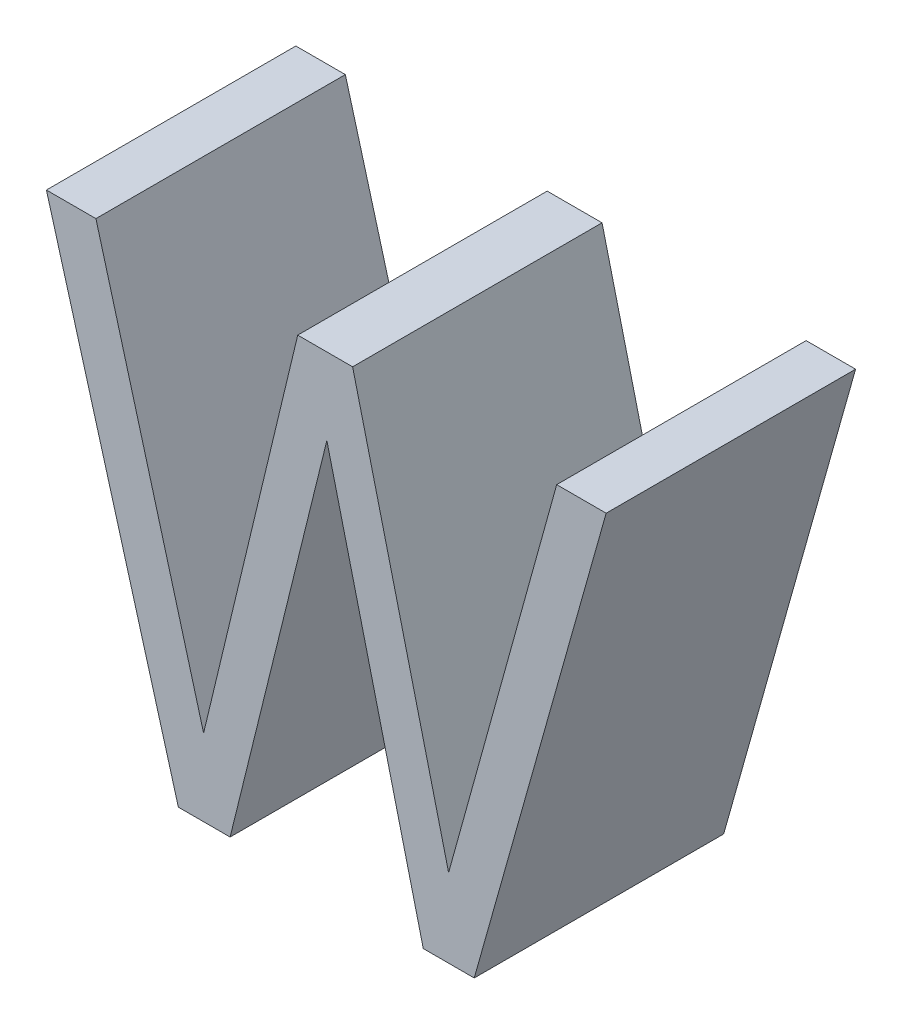
ISO-10303-21;
HEADER;
FILE_DESCRIPTION(('STEP AP214'),'2;1');
FILE_NAME('part.step','',(''),(''),'','','');
FILE_SCHEMA(('AUTOMOTIVE_DESIGN { 1 0 10303 214 1 1 1 1 }'));
ENDSEC;
DATA;
#1=APPLICATION_CONTEXT('core data for automotive mechanical design processes');
#2=APPLICATION_PROTOCOL_DEFINITION('international standard','automotive_design',2000,#1);
#3=PRODUCT_CONTEXT('',#1,'mechanical');
#4=PRODUCT('Part','Part','',(#3));
#5=PRODUCT_RELATED_PRODUCT_CATEGORY('part','',(#4));
#6=PRODUCT_DEFINITION_FORMATION('','',#4);
#7=PRODUCT_DEFINITION_CONTEXT('part definition',#1,'design');
#8=PRODUCT_DEFINITION('design','',#6,#7);
#9=PRODUCT_DEFINITION_SHAPE('','',#8);
#10=(LENGTH_UNIT() NAMED_UNIT(*) SI_UNIT(.MILLI.,.METRE.));
#11=(NAMED_UNIT(*) PLANE_ANGLE_UNIT() SI_UNIT($,.RADIAN.));
#12=(NAMED_UNIT(*) SI_UNIT($,.STERADIAN.) SOLID_ANGLE_UNIT());
#13=UNCERTAINTY_MEASURE_WITH_UNIT(LENGTH_MEASURE(1.E-05),#10,'distance_accuracy_value','');
#14=(GEOMETRIC_REPRESENTATION_CONTEXT(3) GLOBAL_UNCERTAINTY_ASSIGNED_CONTEXT((#13)) GLOBAL_UNIT_ASSIGNED_CONTEXT((#10,
#11,#12)) REPRESENTATION_CONTEXT('',''));
#15=CARTESIAN_POINT('',(0.,0.,0.));
#16=DIRECTION('',(0.,0.,1.));
#17=DIRECTION('',(1.,0.,0.));
#18=AXIS2_PLACEMENT_3D('',#15,#16,#17);
#19=CARTESIAN_POINT('',(-1.835082792432,-5.151383173215,-5.5));
#20=DIRECTION('',(0.,0.,1.));
#21=DIRECTION('',(0.,-1.,0.));
#22=AXIS2_PLACEMENT_3D('',#19,#20,#21);
#23=PLANE('',#22);
#24=DIRECTION('',(0.271054674454794,0.962563952917522,0.));
#25=VECTOR('',#24,1.);
#26=CARTESIAN_POINT('',(-1.24119866919,-6.13847583919,-5.5));
#27=LINE('',#26,#25);
#28=CARTESIAN_POINT('',(-1.24119866919,-6.13847583919,-5.5));
#29=VERTEX_POINT('',#28);
#30=CARTESIAN_POINT('',(-0.71229446919,-4.260241794746,-5.5));
#31=VERTEX_POINT('',#30);
#32=EDGE_CURVE('E182',#29,#31,#27,.T.);
#33=ORIENTED_EDGE('',*,*,#32,.T.);
#34=DIRECTION('',(-1.,0.,0.));
#35=VECTOR('',#34,1.);
#36=CARTESIAN_POINT('',(-0.71229446919,-4.260241794746,-5.5));
#37=LINE('',#36,#35);
#38=CARTESIAN_POINT('',(-0.910606380301,-4.260241794746,-5.5));
#39=VERTEX_POINT('',#38);
#40=EDGE_CURVE('E260',#31,#39,#37,.T.);
#41=ORIENTED_EDGE('',*,*,#40,.T.);
#42=DIRECTION('',(-0.267047823164026,-0.963683277920373,0.));
#43=VECTOR('',#42,1.);
#44=CARTESIAN_POINT('',(-0.910606380301,-4.260241794746,-5.5));
#45=LINE('',#44,#43);
#46=CARTESIAN_POINT('',(-1.343936024746,-5.823978683634,-5.5));
#47=VERTEX_POINT('',#46);
#48=EDGE_CURVE('E215',#39,#47,#45,.T.);
#49=ORIENTED_EDGE('',*,*,#48,.T.);
#50=DIRECTION('',(-0.238953078095094,0.971031115087915,0.));
#51=VECTOR('',#50,1.);
#52=CARTESIAN_POINT('',(-1.343936024746,-5.823978683634,-5.5));
#53=LINE('',#52,#51);
#54=CARTESIAN_POINT('',(-1.728743202523,-4.260241794746,-5.5));
#55=VERTEX_POINT('',#54);
#56=EDGE_CURVE('E194',#47,#55,#53,.T.);
#57=ORIENTED_EDGE('',*,*,#56,.T.);
#58=DIRECTION('',(-1.,0.,0.));
#59=VECTOR('',#58,1.);
#60=CARTESIAN_POINT('',(-1.728743202523,-4.260241794746,-5.5));
#61=LINE('',#60,#59);
#62=CARTESIAN_POINT('',(-1.948789046968,-4.260241794746,-5.5));
#63=VERTEX_POINT('',#62);
#64=EDGE_CURVE('E150',#55,#63,#61,.T.);
#65=ORIENTED_EDGE('',*,*,#64,.T.);
#66=DIRECTION('',(-0.233642560836271,-0.972322556441981,0.));
#67=VECTOR('',#66,1.);
#68=CARTESIAN_POINT('',(-1.948789046968,-4.260241794746,-5.5));
#69=LINE('',#68,#67);
#70=CARTESIAN_POINT('',(-2.326182246968,-5.830794350301,-5.5));
#71=VERTEX_POINT('',#70);
#72=EDGE_CURVE('E146',#63,#71,#69,.T.);
#73=ORIENTED_EDGE('',*,*,#72,.T.);
#74=DIRECTION('',(-0.265058017413111,0.964232465438201,0.));
#75=VECTOR('',#74,1.);
#76=CARTESIAN_POINT('',(-2.326182246968,-5.830794350301,-5.5));
#77=LINE('',#76,#75);
#78=CARTESIAN_POINT('',(-2.757911691412,-4.260241794746,-5.5));
#79=VERTEX_POINT('',#78);
#80=EDGE_CURVE('E132',#71,#79,#77,.T.);
#81=ORIENTED_EDGE('',*,*,#80,.T.);
#82=DIRECTION('',(-1.,0.,0.));
#83=VECTOR('',#82,1.);
#84=CARTESIAN_POINT('',(-2.757911691412,-4.260241794746,-5.5));
#85=LINE('',#84,#83);
#86=CARTESIAN_POINT('',(-2.95635906919,-4.260241794746,-5.5));
#87=VERTEX_POINT('',#86);
#88=EDGE_CURVE('E195',#79,#87,#85,.T.);
#89=ORIENTED_EDGE('',*,*,#88,.T.);
#90=DIRECTION('',(0.271118996413233,-0.962545837757289,0.));
#91=VECTOR('',#90,1.);
#92=CARTESIAN_POINT('',(-2.95635906919,-4.260241794746,-5.5));
#93=LINE('',#92,#91);
#94=CARTESIAN_POINT('',(-2.427319402523,-6.13847583919,-5.5));
#95=VERTEX_POINT('',#94);
#96=EDGE_CURVE('E220',#87,#95,#93,.T.);
#97=ORIENTED_EDGE('',*,*,#96,.T.);
#98=DIRECTION('',(1.,0.,0.));
#99=VECTOR('',#98,1.);
#100=CARTESIAN_POINT('',(-2.427319402523,-6.13847583919,-5.5));
#101=LINE('',#100,#99);
#102=CARTESIAN_POINT('',(-2.219869135857,-6.13847583919,-5.5));
#103=VERTEX_POINT('',#102);
#104=EDGE_CURVE('E169',#95,#103,#101,.T.);
#105=ORIENTED_EDGE('',*,*,#104,.T.);
#106=DIRECTION('',(0.239734119890295,0.970838581722227,0.));
#107=VECTOR('',#106,1.);
#108=CARTESIAN_POINT('',(-2.219869135857,-6.13847583919,-5.5));
#109=LINE('',#108,#107);
#110=CARTESIAN_POINT('',(-1.832011135857,-4.567787816968,-5.5));
#111=VERTEX_POINT('',#110);
#112=EDGE_CURVE('E175',#103,#111,#109,.T.);
#113=ORIENTED_EDGE('',*,*,#112,.T.);
#114=DIRECTION('',(0.238966075466545,-0.971027916579188,0.));
#115=VECTOR('',#114,1.);
#116=CARTESIAN_POINT('',(-1.832011135857,-4.567787816968,-5.5));
#117=LINE('',#116,#115);
#118=CARTESIAN_POINT('',(-1.445471113635,-6.13847583919,-5.5));
#119=VERTEX_POINT('',#118);
#120=EDGE_CURVE('E233',#111,#119,#117,.T.);
#121=ORIENTED_EDGE('',*,*,#120,.T.);
#122=DIRECTION('',(1.,0.,0.));
#123=VECTOR('',#122,1.);
#124=CARTESIAN_POINT('',(-1.445471113635,-6.13847583919,-5.5));
#125=LINE('',#124,#123);
#126=EDGE_CURVE('E11',#119,#29,#125,.T.);
#127=ORIENTED_EDGE('',*,*,#126,.T.);
#128=EDGE_LOOP('',(#33,#41,#49,#57,#65,#73,#81,#89,#97,#105,#113,#121,#127));
#129=FACE_BOUND('',#128,.T.);
#130=ADVANCED_FACE('F16',(#129),#23,.T.);
#131=CARTESIAN_POINT('',(-1.835082792432,-5.151383173215,-6.5));
#132=DIRECTION('',(0.,0.,1.));
#133=DIRECTION('',(0.,-1.,0.));
#134=AXIS2_PLACEMENT_3D('',#131,#132,#133);
#135=PLANE('',#134);
#136=DIRECTION('',(0.271054674454794,0.962563952917522,0.));
#137=VECTOR('',#136,1.);
#138=CARTESIAN_POINT('',(-1.24119866919,-6.13847583919,-6.5));
#139=LINE('',#138,#137);
#140=CARTESIAN_POINT('',(-1.24119866919,-6.13847583919,-6.5));
#141=VERTEX_POINT('',#140);
#142=CARTESIAN_POINT('',(-0.71229446919,-4.260241794746,-6.5));
#143=VERTEX_POINT('',#142);
#144=EDGE_CURVE('E205',#141,#143,#139,.T.);
#145=ORIENTED_EDGE('',*,*,#144,.F.);
#146=DIRECTION('',(1.,0.,0.));
#147=VECTOR('',#146,1.);
#148=CARTESIAN_POINT('',(-1.445471113635,-6.13847583919,-6.5));
#149=LINE('',#148,#147);
#150=CARTESIAN_POINT('',(-1.445471113635,-6.13847583919,-6.5));
#151=VERTEX_POINT('',#150);
#152=EDGE_CURVE('E27',#151,#141,#149,.T.);
#153=ORIENTED_EDGE('',*,*,#152,.F.);
#154=DIRECTION('',(0.238966075466545,-0.971027916579188,0.));
#155=VECTOR('',#154,1.);
#156=CARTESIAN_POINT('',(-1.832011135857,-4.567787816968,-6.5));
#157=LINE('',#156,#155);
#158=CARTESIAN_POINT('',(-1.832011135857,-4.567787816968,-6.5));
#159=VERTEX_POINT('',#158);
#160=EDGE_CURVE('E231',#159,#151,#157,.T.);
#161=ORIENTED_EDGE('',*,*,#160,.F.);
#162=DIRECTION('',(0.239734119890295,0.970838581722227,0.));
#163=VECTOR('',#162,1.);
#164=CARTESIAN_POINT('',(-2.219869135857,-6.13847583919,-6.5));
#165=LINE('',#164,#163);
#166=CARTESIAN_POINT('',(-2.219869135857,-6.13847583919,-6.5));
#167=VERTEX_POINT('',#166);
#168=EDGE_CURVE('E176',#167,#159,#165,.T.);
#169=ORIENTED_EDGE('',*,*,#168,.F.);
#170=DIRECTION('',(1.,0.,0.));
#171=VECTOR('',#170,1.);
#172=CARTESIAN_POINT('',(-2.427319402523,-6.13847583919,-6.5));
#173=LINE('',#172,#171);
#174=CARTESIAN_POINT('',(-2.427319402523,-6.13847583919,-6.5));
#175=VERTEX_POINT('',#174);
#176=EDGE_CURVE('E170',#175,#167,#173,.T.);
#177=ORIENTED_EDGE('',*,*,#176,.F.);
#178=DIRECTION('',(0.271118996413233,-0.962545837757289,0.));
#179=VECTOR('',#178,1.);
#180=CARTESIAN_POINT('',(-2.95635906919,-4.260241794746,-6.5));
#181=LINE('',#180,#179);
#182=CARTESIAN_POINT('',(-2.95635906919,-4.260241794746,-6.5));
#183=VERTEX_POINT('',#182);
#184=EDGE_CURVE('E198',#183,#175,#181,.T.);
#185=ORIENTED_EDGE('',*,*,#184,.F.);
#186=DIRECTION('',(-1.,0.,0.));
#187=VECTOR('',#186,1.);
#188=CARTESIAN_POINT('',(-2.757911691412,-4.260241794746,-6.5));
#189=LINE('',#188,#187);
#190=CARTESIAN_POINT('',(-2.757911691412,-4.260241794746,-6.5));
#191=VERTEX_POINT('',#190);
#192=EDGE_CURVE('E20',#191,#183,#189,.T.);
#193=ORIENTED_EDGE('',*,*,#192,.F.);
#194=DIRECTION('',(-0.265058017413111,0.964232465438201,0.));
#195=VECTOR('',#194,1.);
#196=CARTESIAN_POINT('',(-2.326182246968,-5.830794350301,-6.5));
#197=LINE('',#196,#195);
#198=CARTESIAN_POINT('',(-2.326182246968,-5.830794350301,-6.5));
#199=VERTEX_POINT('',#198);
#200=EDGE_CURVE('E155',#199,#191,#197,.T.);
#201=ORIENTED_EDGE('',*,*,#200,.F.);
#202=DIRECTION('',(-0.233642560836271,-0.972322556441981,0.));
#203=VECTOR('',#202,1.);
#204=CARTESIAN_POINT('',(-1.948789046968,-4.260241794746,-6.5));
#205=LINE('',#204,#203);
#206=CARTESIAN_POINT('',(-1.948789046968,-4.260241794746,-6.5));
#207=VERTEX_POINT('',#206);
#208=EDGE_CURVE('E158',#207,#199,#205,.T.);
#209=ORIENTED_EDGE('',*,*,#208,.F.);
#210=DIRECTION('',(-1.,0.,0.));
#211=VECTOR('',#210,1.);
#212=CARTESIAN_POINT('',(-1.728743202523,-4.260241794746,-6.5));
#213=LINE('',#212,#211);
#214=CARTESIAN_POINT('',(-1.728743202523,-4.260241794746,-6.5));
#215=VERTEX_POINT('',#214);
#216=EDGE_CURVE('E189',#215,#207,#213,.T.);
#217=ORIENTED_EDGE('',*,*,#216,.F.);
#218=DIRECTION('',(-0.238953078095094,0.971031115087915,0.));
#219=VECTOR('',#218,1.);
#220=CARTESIAN_POINT('',(-1.343936024746,-5.823978683634,-6.5));
#221=LINE('',#220,#219);
#222=CARTESIAN_POINT('',(-1.343936024746,-5.823978683634,-6.5));
#223=VERTEX_POINT('',#222);
#224=EDGE_CURVE('E210',#223,#215,#221,.T.);
#225=ORIENTED_EDGE('',*,*,#224,.F.);
#226=DIRECTION('',(-0.267047823164026,-0.963683277920373,0.));
#227=VECTOR('',#226,1.);
#228=CARTESIAN_POINT('',(-0.910606380301,-4.260241794746,-6.5));
#229=LINE('',#228,#227);
#230=CARTESIAN_POINT('',(-0.910606380301,-4.260241794746,-6.5));
#231=VERTEX_POINT('',#230);
#232=EDGE_CURVE('E256',#231,#223,#229,.T.);
#233=ORIENTED_EDGE('',*,*,#232,.F.);
#234=DIRECTION('',(-1.,0.,0.));
#235=VECTOR('',#234,1.);
#236=CARTESIAN_POINT('',(-0.71229446919,-4.260241794746,-6.5));
#237=LINE('',#236,#235);
#238=EDGE_CURVE('E185',#143,#231,#237,.T.);
#239=ORIENTED_EDGE('',*,*,#238,.F.);
#240=EDGE_LOOP('',(#145,#153,#161,#169,#177,#185,#193,#201,#209,#217,#225,#233,#239));
#241=FACE_BOUND('',#240,.T.);
#242=ADVANCED_FACE('F289',(#241),#135,.F.);
#243=CARTESIAN_POINT('',(-1.3433348914125,-6.13847583919,-5.49));
#244=DIRECTION('',(0.,1.,0.));
#245=DIRECTION('',(-1.,0.,0.));
#246=AXIS2_PLACEMENT_3D('',#243,#244,#245);
#247=PLANE('',#246);
#248=DIRECTION('',(0.,0.,1.));
#249=VECTOR('',#248,1.);
#250=CARTESIAN_POINT('',(-1.445471113635,-6.13847583919,-6.5));
#251=LINE('',#250,#249);
#252=EDGE_CURVE('E236',#151,#119,#251,.T.);
#253=ORIENTED_EDGE('',*,*,#252,.F.);
#254=ORIENTED_EDGE('',*,*,#152,.T.);
#255=DIRECTION('',(0.,0.,1.));
#256=VECTOR('',#255,1.);
#257=CARTESIAN_POINT('',(-1.24119866919,-6.13847583919,-6.5));
#258=LINE('',#257,#256);
#259=EDGE_CURVE('E246',#141,#29,#258,.T.);
#260=ORIENTED_EDGE('',*,*,#259,.T.);
#261=ORIENTED_EDGE('',*,*,#126,.F.);
#262=EDGE_LOOP('',(#253,#254,#260,#261));
#263=FACE_BOUND('',#262,.T.);
#264=ADVANCED_FACE('F312',(#263),#247,.F.);
#265=CARTESIAN_POINT('',(-1.638741124746,-5.353131828079,-5.49));
#266=DIRECTION('',(0.971027916579188,0.238966075466545,0.));
#267=DIRECTION('',(0.,0.,-1.));
#268=AXIS2_PLACEMENT_3D('',#265,#266,#267);
#269=PLANE('',#268);
#270=DIRECTION('',(0.,0.,1.));
#271=VECTOR('',#270,1.);
#272=CARTESIAN_POINT('',(-1.832011135857,-4.567787816968,-6.5));
#273=LINE('',#272,#271);
#274=EDGE_CURVE('E171',#159,#111,#273,.T.);
#275=ORIENTED_EDGE('',*,*,#274,.F.);
#276=ORIENTED_EDGE('',*,*,#160,.T.);
#277=ORIENTED_EDGE('',*,*,#252,.T.);
#278=ORIENTED_EDGE('',*,*,#120,.F.);
#279=EDGE_LOOP('',(#275,#276,#277,#278));
#280=FACE_BOUND('',#279,.T.);
#281=ADVANCED_FACE('F311',(#280),#269,.F.);
#282=CARTESIAN_POINT('',(-2.025940135857,-5.353131828079,-5.49));
#283=DIRECTION('',(-0.970838581722227,0.239734119890295,0.));
#284=DIRECTION('',(0.,0.,1.));
#285=AXIS2_PLACEMENT_3D('',#282,#283,#284);
#286=PLANE('',#285);
#287=DIRECTION('',(0.,0.,1.));
#288=VECTOR('',#287,1.);
#289=CARTESIAN_POINT('',(-2.219869135857,-6.13847583919,-6.5));
#290=LINE('',#289,#288);
#291=EDGE_CURVE('E166',#167,#103,#290,.T.);
#292=ORIENTED_EDGE('',*,*,#291,.F.);
#293=ORIENTED_EDGE('',*,*,#168,.T.);
#294=ORIENTED_EDGE('',*,*,#274,.T.);
#295=ORIENTED_EDGE('',*,*,#112,.F.);
#296=EDGE_LOOP('',(#292,#293,#294,#295));
#297=FACE_BOUND('',#296,.T.);
#298=ADVANCED_FACE('F309',(#297),#286,.F.);
#299=CARTESIAN_POINT('',(-2.32359426919,-6.13847583919,-5.49));
#300=DIRECTION('',(0.,1.,0.));
#301=DIRECTION('',(-1.,0.,0.));
#302=AXIS2_PLACEMENT_3D('',#299,#300,#301);
#303=PLANE('',#302);
#304=DIRECTION('',(0.,0.,1.));
#305=VECTOR('',#304,1.);
#306=CARTESIAN_POINT('',(-2.427319402523,-6.13847583919,-6.5));
#307=LINE('',#306,#305);
#308=EDGE_CURVE('E216',#175,#95,#307,.T.);
#309=ORIENTED_EDGE('',*,*,#308,.F.);
#310=ORIENTED_EDGE('',*,*,#176,.T.);
#311=ORIENTED_EDGE('',*,*,#291,.T.);
#312=ORIENTED_EDGE('',*,*,#104,.F.);
#313=EDGE_LOOP('',(#309,#310,#311,#312));
#314=FACE_BOUND('',#313,.T.);
#315=ADVANCED_FACE('F305',(#314),#303,.F.);
#316=CARTESIAN_POINT('',(-2.6918392358565,-5.199358816968,-5.49));
#317=DIRECTION('',(0.962545837757289,0.271118996413233,0.));
#318=DIRECTION('',(0.,0.,-1.));
#319=AXIS2_PLACEMENT_3D('',#316,#317,#318);
#320=PLANE('',#319);
#321=DIRECTION('',(0.,0.,1.));
#322=VECTOR('',#321,1.);
#323=CARTESIAN_POINT('',(-2.95635906919,-4.260241794746,-6.5));
#324=LINE('',#323,#322);
#325=EDGE_CURVE('E199',#183,#87,#324,.T.);
#326=ORIENTED_EDGE('',*,*,#325,.F.);
#327=ORIENTED_EDGE('',*,*,#184,.T.);
#328=ORIENTED_EDGE('',*,*,#308,.T.);
#329=ORIENTED_EDGE('',*,*,#96,.F.);
#330=EDGE_LOOP('',(#326,#327,#328,#329));
#331=FACE_BOUND('',#330,.T.);
#332=ADVANCED_FACE('F299',(#331),#320,.F.);
#333=CARTESIAN_POINT('',(-2.857135380301,-4.260241794746,-5.49));
#334=DIRECTION('',(0.,-1.,0.));
#335=DIRECTION('',(0.,0.,1.));
#336=AXIS2_PLACEMENT_3D('',#333,#334,#335);
#337=PLANE('',#336);
#338=DIRECTION('',(0.,0.,1.));
#339=VECTOR('',#338,1.);
#340=CARTESIAN_POINT('',(-2.757911691412,-4.260241794746,-6.5));
#341=LINE('',#340,#339);
#342=EDGE_CURVE('E140',#191,#79,#341,.T.);
#343=ORIENTED_EDGE('',*,*,#342,.F.);
#344=ORIENTED_EDGE('',*,*,#192,.T.);
#345=ORIENTED_EDGE('',*,*,#325,.T.);
#346=ORIENTED_EDGE('',*,*,#88,.F.);
#347=EDGE_LOOP('',(#343,#344,#345,#346));
#348=FACE_BOUND('',#347,.T.);
#349=ADVANCED_FACE('F294',(#348),#337,.F.);
#350=CARTESIAN_POINT('',(-2.54204696919,-5.0455180725235,-5.49));
#351=DIRECTION('',(-0.964232465438201,-0.265058017413111,0.));
#352=DIRECTION('',(0.,0.,1.));
#353=AXIS2_PLACEMENT_3D('',#350,#351,#352);
#354=PLANE('',#353);
#355=DIRECTION('',(0.,0.,1.));
#356=VECTOR('',#355,1.);
#357=CARTESIAN_POINT('',(-2.326182246968,-5.830794350301,-6.5));
#358=LINE('',#357,#356);
#359=EDGE_CURVE('E137',#199,#71,#358,.T.);
#360=ORIENTED_EDGE('',*,*,#359,.F.);
#361=ORIENTED_EDGE('',*,*,#200,.T.);
#362=ORIENTED_EDGE('',*,*,#342,.T.);
#363=ORIENTED_EDGE('',*,*,#80,.F.);
#364=EDGE_LOOP('',(#360,#361,#362,#363));
#365=FACE_BOUND('',#364,.T.);
#366=ADVANCED_FACE('F134',(#365),#354,.F.);
#367=CARTESIAN_POINT('',(-2.137485646968,-5.0455180725235,-5.49));
#368=DIRECTION('',(0.972322556441981,-0.233642560836271,0.));
#369=DIRECTION('',(0.233642560836271,0.972322556441981,0.));
#370=AXIS2_PLACEMENT_3D('',#367,#368,#369);
#371=PLANE('',#370);
#372=DIRECTION('',(0.,0.,1.));
#373=VECTOR('',#372,1.);
#374=CARTESIAN_POINT('',(-1.948789046968,-4.260241794746,-6.5));
#375=LINE('',#374,#373);
#376=EDGE_CURVE('E193',#207,#63,#375,.T.);
#377=ORIENTED_EDGE('',*,*,#376,.F.);
#378=ORIENTED_EDGE('',*,*,#208,.T.);
#379=ORIENTED_EDGE('',*,*,#359,.T.);
#380=ORIENTED_EDGE('',*,*,#72,.F.);
#381=EDGE_LOOP('',(#377,#378,#379,#380));
#382=FACE_BOUND('',#381,.T.);
#383=ADVANCED_FACE('F157',(#382),#371,.F.);
#384=CARTESIAN_POINT('',(-1.8387661247455,-4.260241794746,-5.49));
#385=DIRECTION('',(0.,-1.,0.));
#386=DIRECTION('',(0.,0.,1.));
#387=AXIS2_PLACEMENT_3D('',#384,#385,#386);
#388=PLANE('',#387);
#389=DIRECTION('',(0.,0.,1.));
#390=VECTOR('',#389,1.);
#391=CARTESIAN_POINT('',(-1.728743202523,-4.260241794746,-6.5));
#392=LINE('',#391,#390);
#393=EDGE_CURVE('E214',#215,#55,#392,.T.);
#394=ORIENTED_EDGE('',*,*,#393,.F.);
#395=ORIENTED_EDGE('',*,*,#216,.T.);
#396=ORIENTED_EDGE('',*,*,#376,.T.);
#397=ORIENTED_EDGE('',*,*,#64,.F.);
#398=EDGE_LOOP('',(#394,#395,#396,#397));
#399=FACE_BOUND('',#398,.T.);
#400=ADVANCED_FACE('F286',(#399),#388,.F.);
#401=CARTESIAN_POINT('',(-1.5363396136345,-5.04211023919,-5.49));
#402=DIRECTION('',(-0.971031115087915,-0.238953078095094,0.));
#403=DIRECTION('',(0.,0.,1.));
#404=AXIS2_PLACEMENT_3D('',#401,#402,#403);
#405=PLANE('',#404);
#406=DIRECTION('',(0.,0.,1.));
#407=VECTOR('',#406,1.);
#408=CARTESIAN_POINT('',(-1.343936024746,-5.823978683634,-6.5));
#409=LINE('',#408,#407);
#410=EDGE_CURVE('E243',#223,#47,#409,.T.);
#411=ORIENTED_EDGE('',*,*,#410,.F.);
#412=ORIENTED_EDGE('',*,*,#224,.T.);
#413=ORIENTED_EDGE('',*,*,#393,.T.);
#414=ORIENTED_EDGE('',*,*,#56,.F.);
#415=EDGE_LOOP('',(#411,#412,#413,#414));
#416=FACE_BOUND('',#415,.T.);
#417=ADVANCED_FACE('F323',(#416),#405,.F.);
#418=CARTESIAN_POINT('',(-1.1272712025235,-5.04211023919,-5.49));
#419=DIRECTION('',(0.963683277920373,-0.267047823164026,0.));
#420=DIRECTION('',(0.267047823164026,0.963683277920373,0.));
#421=AXIS2_PLACEMENT_3D('',#418,#419,#420);
#422=PLANE('',#421);
#423=DIRECTION('',(0.,0.,1.));
#424=VECTOR('',#423,1.);
#425=CARTESIAN_POINT('',(-0.910606380301,-4.260241794746,-6.5));
#426=LINE('',#425,#424);
#427=EDGE_CURVE('E209',#231,#39,#426,.T.);
#428=ORIENTED_EDGE('',*,*,#427,.F.);
#429=ORIENTED_EDGE('',*,*,#232,.T.);
#430=ORIENTED_EDGE('',*,*,#410,.T.);
#431=ORIENTED_EDGE('',*,*,#48,.F.);
#432=EDGE_LOOP('',(#428,#429,#430,#431));
#433=FACE_BOUND('',#432,.T.);
#434=ADVANCED_FACE('F321',(#433),#422,.F.);
#435=CARTESIAN_POINT('',(-0.8114504247455,-4.260241794746,-5.49));
#436=DIRECTION('',(0.,-1.,0.));
#437=DIRECTION('',(0.,0.,1.));
#438=AXIS2_PLACEMENT_3D('',#435,#436,#437);
#439=PLANE('',#438);
#440=DIRECTION('',(0.,0.,1.));
#441=VECTOR('',#440,1.);
#442=CARTESIAN_POINT('',(-0.71229446919,-4.260241794746,-6.5));
#443=LINE('',#442,#441);
#444=EDGE_CURVE('E186',#143,#31,#443,.T.);
#445=ORIENTED_EDGE('',*,*,#444,.F.);
#446=ORIENTED_EDGE('',*,*,#238,.T.);
#447=ORIENTED_EDGE('',*,*,#427,.T.);
#448=ORIENTED_EDGE('',*,*,#40,.F.);
#449=EDGE_LOOP('',(#445,#446,#447,#448));
#450=FACE_BOUND('',#449,.T.);
#451=ADVANCED_FACE('F319',(#450),#439,.F.);
#452=CARTESIAN_POINT('',(-0.97674656919,-5.199358816968,-5.49));
#453=DIRECTION('',(-0.962563952917522,0.271054674454794,0.));
#454=DIRECTION('',(0.,0.,1.));
#455=AXIS2_PLACEMENT_3D('',#452,#453,#454);
#456=PLANE('',#455);
#457=ORIENTED_EDGE('',*,*,#259,.F.);
#458=ORIENTED_EDGE('',*,*,#144,.T.);
#459=ORIENTED_EDGE('',*,*,#444,.T.);
#460=ORIENTED_EDGE('',*,*,#32,.F.);
#461=EDGE_LOOP('',(#457,#458,#459,#460));
#462=FACE_BOUND('',#461,.T.);
#463=ADVANCED_FACE('F18',(#462),#456,.F.);
#464=CLOSED_SHELL('',(#130,#242,#264,#281,#298,#315,#332,#349,#366,#383,#400,#417,#434,#451,#463));
#465=MANIFOLD_SOLID_BREP('B1',#464);
#466=ADVANCED_BREP_SHAPE_REPRESENTATION('',(#18,#465),#14);
#467=SHAPE_DEFINITION_REPRESENTATION(#9,#466);
ENDSEC;
END-ISO-10303-21;
